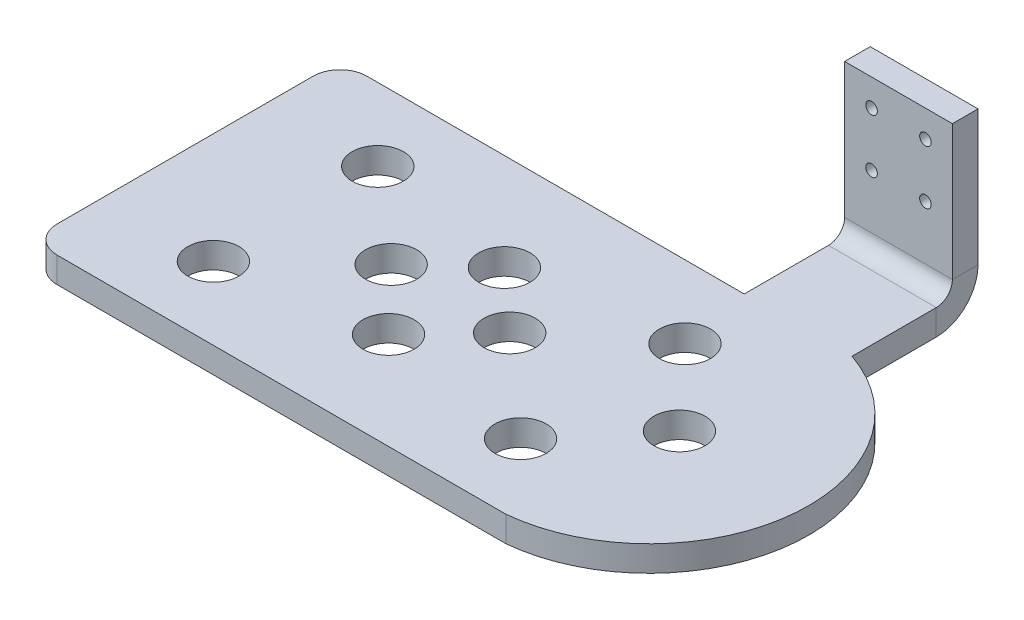
ISO-10303-21;
HEADER;
FILE_DESCRIPTION(('STEP AP214'),'2;1');
FILE_NAME('part.step','',(''),(''),'','','');
FILE_SCHEMA(('AUTOMOTIVE_DESIGN { 1 0 10303 214 1 1 1 1 }'));
ENDSEC;
DATA;
#1=APPLICATION_CONTEXT('core data for automotive mechanical design processes');
#2=APPLICATION_PROTOCOL_DEFINITION('international standard','automotive_design',2000,#1);
#3=PRODUCT_CONTEXT('',#1,'mechanical');
#4=PRODUCT('Part','Part','',(#3));
#5=PRODUCT_RELATED_PRODUCT_CATEGORY('part','',(#4));
#6=PRODUCT_DEFINITION_FORMATION('','',#4);
#7=PRODUCT_DEFINITION_CONTEXT('part definition',#1,'design');
#8=PRODUCT_DEFINITION('design','',#6,#7);
#9=PRODUCT_DEFINITION_SHAPE('','',#8);
#10=(LENGTH_UNIT() NAMED_UNIT(*) SI_UNIT(.MILLI.,.METRE.));
#11=(NAMED_UNIT(*) PLANE_ANGLE_UNIT() SI_UNIT($,.RADIAN.));
#12=(NAMED_UNIT(*) SI_UNIT($,.STERADIAN.) SOLID_ANGLE_UNIT());
#13=UNCERTAINTY_MEASURE_WITH_UNIT(LENGTH_MEASURE(1.E-05),#10,'distance_accuracy_value','');
#14=(GEOMETRIC_REPRESENTATION_CONTEXT(3) GLOBAL_UNCERTAINTY_ASSIGNED_CONTEXT((#13)) GLOBAL_UNIT_ASSIGNED_CONTEXT((#10,
#11,#12)) REPRESENTATION_CONTEXT('',''));
#15=CARTESIAN_POINT('',(0.,0.,0.));
#16=DIRECTION('',(0.,0.,1.));
#17=DIRECTION('',(1.,0.,0.));
#18=AXIS2_PLACEMENT_3D('',#15,#16,#17);
#19=CARTESIAN_POINT('',(170.75,-88.6717634175328,-37.2500000000004));
#20=DIRECTION('',(0.,0.,-1.));
#21=DIRECTION('',(0.,1.,0.));
#22=AXIS2_PLACEMENT_3D('',#19,#20,#21);
#23=PLANE('',#22);
#24=CARTESIAN_POINT('',(160.,35.6139394869549,-37.2499999999999));
#25=DIRECTION('',(0.,0.,1.));
#26=DIRECTION('',(0.,-1.,0.));
#27=AXIS2_PLACEMENT_3D('',#24,#25,#26);
#28=CIRCLE('',#27,2.15000000000001);
#29=CARTESIAN_POINT('',(160.,33.4639394869548,-37.2499999999999));
#30=VERTEX_POINT('',#29);
#31=EDGE_CURVE('E131',#30,#30,#28,.T.);
#32=ORIENTED_EDGE('',*,*,#31,.F.);
#33=EDGE_LOOP('',(#32));
#34=FACE_BOUND('',#33,.T.);
#35=CARTESIAN_POINT('',(180.,35.6139394869549,-37.2499999999999));
#36=DIRECTION('',(0.,0.,1.));
#37=DIRECTION('',(0.,-1.,0.));
#38=AXIS2_PLACEMENT_3D('',#35,#36,#37);
#39=CIRCLE('',#38,2.15000000000001);
#40=CARTESIAN_POINT('',(180.,33.4639394869549,-37.2499999999999));
#41=VERTEX_POINT('',#40);
#42=EDGE_CURVE('E125',#41,#41,#39,.T.);
#43=ORIENTED_EDGE('',*,*,#42,.F.);
#44=EDGE_LOOP('',(#43));
#45=FACE_BOUND('',#44,.T.);
#46=CARTESIAN_POINT('',(180.,55.6139394869549,-37.2499999999999));
#47=DIRECTION('',(0.,0.,1.));
#48=DIRECTION('',(0.,-1.,0.));
#49=AXIS2_PLACEMENT_3D('',#46,#47,#48);
#50=CIRCLE('',#49,2.15000000000001);
#51=CARTESIAN_POINT('',(180.,53.4639394869549,-37.2499999999999));
#52=VERTEX_POINT('',#51);
#53=EDGE_CURVE('E119',#52,#52,#50,.T.);
#54=ORIENTED_EDGE('',*,*,#53,.F.);
#55=EDGE_LOOP('',(#54));
#56=FACE_BOUND('',#55,.T.);
#57=CARTESIAN_POINT('',(160.,55.6139394869549,-37.2499999999999));
#58=DIRECTION('',(0.,0.,1.));
#59=DIRECTION('',(0.,-1.,0.));
#60=AXIS2_PLACEMENT_3D('',#57,#58,#59);
#61=CIRCLE('',#60,2.15000000000001);
#62=CARTESIAN_POINT('',(160.,53.4639394869548,-37.2499999999999));
#63=VERTEX_POINT('',#62);
#64=EDGE_CURVE('E106',#63,#63,#61,.T.);
#65=ORIENTED_EDGE('',*,*,#64,.F.);
#66=EDGE_LOOP('',(#65));
#67=FACE_BOUND('',#66,.T.);
#68=DIRECTION('',(0.,-1.,0.));
#69=VECTOR('',#68,1.);
#70=CARTESIAN_POINT('',(150.,-32.6360605130452,-37.2500000000002));
#71=LINE('',#70,#69);
#72=CARTESIAN_POINT('',(150.,65.6139394869548,-37.2499999999998));
#73=VERTEX_POINT('',#72);
#74=CARTESIAN_POINT('',(150.,15.5,-37.25));
#75=VERTEX_POINT('',#74);
#76=EDGE_CURVE('E45',#73,#75,#71,.T.);
#77=ORIENTED_EDGE('',*,*,#76,.T.);
#78=DIRECTION('',(1.,0.,0.));
#79=VECTOR('',#78,1.);
#80=CARTESIAN_POINT('',(170.75,15.5,-37.25));
#81=LINE('',#80,#79);
#82=CARTESIAN_POINT('',(190.,15.5,-37.25));
#83=VERTEX_POINT('',#82);
#84=EDGE_CURVE('E111',#75,#83,#81,.T.);
#85=ORIENTED_EDGE('',*,*,#84,.T.);
#86=DIRECTION('',(0.,1.,0.));
#87=VECTOR('',#86,1.);
#88=CARTESIAN_POINT('',(190.,-32.6360605130452,-37.2500000000002));
#89=LINE('',#88,#87);
#90=CARTESIAN_POINT('',(190.,65.6139394869548,-37.2499999999998));
#91=VERTEX_POINT('',#90);
#92=EDGE_CURVE('E103',#83,#91,#89,.T.);
#93=ORIENTED_EDGE('',*,*,#92,.T.);
#94=DIRECTION('',(-1.,0.,0.));
#95=VECTOR('',#94,1.);
#96=CARTESIAN_POINT('',(150.,65.6139394869548,-37.2499999999998));
#97=LINE('',#96,#95);
#98=EDGE_CURVE('E67',#91,#73,#97,.T.);
#99=ORIENTED_EDGE('',*,*,#98,.T.);
#100=EDGE_LOOP('',(#77,#85,#93,#99));
#101=FACE_BOUND('',#100,.T.);
#102=ADVANCED_FACE('F41',(#34,#45,#56,#67,#101),#23,.F.);
#103=CARTESIAN_POINT('',(190.,-32.6360605130452,-37.2500000000002));
#104=DIRECTION('',(-1.,0.,0.));
#105=DIRECTION('',(0.,-1.,0.));
#106=AXIS2_PLACEMENT_3D('',#103,#104,#105);
#107=PLANE('',#106);
#108=ORIENTED_EDGE('',*,*,#92,.F.);
#109=DIRECTION('',(0.,0.,-1.));
#110=VECTOR('',#109,1.);
#111=CARTESIAN_POINT('',(190.,15.5,-37.25));
#112=LINE('',#111,#110);
#113=CARTESIAN_POINT('',(190.,15.5000000000001,-46.75));
#114=VERTEX_POINT('',#113);
#115=EDGE_CURVE('E12',#83,#114,#112,.T.);
#116=ORIENTED_EDGE('',*,*,#115,.T.);
#117=DIRECTION('',(0.,1.,0.));
#118=VECTOR('',#117,1.);
#119=CARTESIAN_POINT('',(190.,-32.6360605130451,-46.7500000000002));
#120=LINE('',#119,#118);
#121=CARTESIAN_POINT('',(190.,65.6139394869549,-46.7499999999998));
#122=VERTEX_POINT('',#121);
#123=EDGE_CURVE('E91',#114,#122,#120,.T.);
#124=ORIENTED_EDGE('',*,*,#123,.T.);
#125=DIRECTION('',(0.,0.,-1.));
#126=VECTOR('',#125,1.);
#127=CARTESIAN_POINT('',(190.,65.6139394869548,-37.2499999999998));
#128=LINE('',#127,#126);
#129=EDGE_CURVE('E86',#91,#122,#128,.T.);
#130=ORIENTED_EDGE('',*,*,#129,.F.);
#131=EDGE_LOOP('',(#108,#116,#124,#130));
#132=FACE_BOUND('',#131,.T.);
#133=ADVANCED_FACE('F43',(#132),#107,.F.);
#134=CARTESIAN_POINT('',(150.,-32.6360605130452,-37.2500000000002));
#135=DIRECTION('',(1.,0.,0.));
#136=DIRECTION('',(0.,1.,0.));
#137=AXIS2_PLACEMENT_3D('',#134,#135,#136);
#138=PLANE('',#137);
#139=DIRECTION('',(0.,-1.,0.));
#140=VECTOR('',#139,1.);
#141=CARTESIAN_POINT('',(150.,-32.6360605130451,-46.7500000000002));
#142=LINE('',#141,#140);
#143=CARTESIAN_POINT('',(150.,65.6139394869549,-46.7499999999998));
#144=VERTEX_POINT('',#143);
#145=CARTESIAN_POINT('',(150.,15.5000000000001,-46.75));
#146=VERTEX_POINT('',#145);
#147=EDGE_CURVE('E90',#144,#146,#142,.T.);
#148=ORIENTED_EDGE('',*,*,#147,.T.);
#149=DIRECTION('',(0.,0.,1.));
#150=VECTOR('',#149,1.);
#151=CARTESIAN_POINT('',(150.,15.5,-37.25));
#152=LINE('',#151,#150);
#153=EDGE_CURVE('E109',#146,#75,#152,.T.);
#154=ORIENTED_EDGE('',*,*,#153,.T.);
#155=ORIENTED_EDGE('',*,*,#76,.F.);
#156=DIRECTION('',(0.,0.,-1.));
#157=VECTOR('',#156,1.);
#158=CARTESIAN_POINT('',(150.,65.6139394869548,-37.2499999999998));
#159=LINE('',#158,#157);
#160=EDGE_CURVE('E83',#73,#144,#159,.T.);
#161=ORIENTED_EDGE('',*,*,#160,.T.);
#162=EDGE_LOOP('',(#148,#154,#155,#161));
#163=FACE_BOUND('',#162,.T.);
#164=ADVANCED_FACE('F95',(#163),#138,.F.);
#165=CARTESIAN_POINT('',(170.75,-88.6717634175327,-46.7500000000004));
#166=DIRECTION('',(0.,0.,-1.));
#167=DIRECTION('',(0.,1.,0.));
#168=AXIS2_PLACEMENT_3D('',#165,#166,#167);
#169=PLANE('',#168);
#170=DIRECTION('',(1.,0.,0.));
#171=VECTOR('',#170,1.);
#172=CARTESIAN_POINT('',(170.75,15.5000000000001,-46.75));
#173=LINE('',#172,#171);
#174=EDGE_CURVE('E50',#146,#114,#173,.T.);
#175=ORIENTED_EDGE('',*,*,#174,.F.);
#176=ORIENTED_EDGE('',*,*,#147,.F.);
#177=DIRECTION('',(-1.,0.,0.));
#178=VECTOR('',#177,1.);
#179=CARTESIAN_POINT('',(150.,65.6139394869549,-46.7499999999998));
#180=LINE('',#179,#178);
#181=EDGE_CURVE('E80',#122,#144,#180,.T.);
#182=ORIENTED_EDGE('',*,*,#181,.F.);
#183=ORIENTED_EDGE('',*,*,#123,.F.);
#184=EDGE_LOOP('',(#175,#176,#182,#183));
#185=FACE_BOUND('',#184,.T.);
#186=CARTESIAN_POINT('',(160.,35.6139394869549,-46.7499999999999));
#187=DIRECTION('',(0.,0.,1.));
#188=DIRECTION('',(0.,-1.,0.));
#189=AXIS2_PLACEMENT_3D('',#186,#187,#188);
#190=CIRCLE('',#189,2.15000000000001);
#191=CARTESIAN_POINT('',(160.,33.4639394869549,-46.7499999999999));
#192=VERTEX_POINT('',#191);
#193=EDGE_CURVE('E134',#192,#192,#190,.T.);
#194=ORIENTED_EDGE('',*,*,#193,.T.);
#195=EDGE_LOOP('',(#194));
#196=FACE_BOUND('',#195,.T.);
#197=CARTESIAN_POINT('',(180.,55.6139394869549,-46.7499999999999));
#198=DIRECTION('',(0.,0.,1.));
#199=DIRECTION('',(0.,-1.,0.));
#200=AXIS2_PLACEMENT_3D('',#197,#198,#199);
#201=CIRCLE('',#200,2.15000000000001);
#202=CARTESIAN_POINT('',(180.,53.4639394869549,-46.7499999999999));
#203=VERTEX_POINT('',#202);
#204=EDGE_CURVE('E122',#203,#203,#201,.T.);
#205=ORIENTED_EDGE('',*,*,#204,.T.);
#206=EDGE_LOOP('',(#205));
#207=FACE_BOUND('',#206,.T.);
#208=CARTESIAN_POINT('',(160.,55.6139394869549,-46.7499999999999));
#209=DIRECTION('',(0.,0.,1.));
#210=DIRECTION('',(0.,-1.,0.));
#211=AXIS2_PLACEMENT_3D('',#208,#209,#210);
#212=CIRCLE('',#211,2.15000000000001);
#213=CARTESIAN_POINT('',(160.,53.4639394869549,-46.7499999999999));
#214=VERTEX_POINT('',#213);
#215=EDGE_CURVE('E116',#214,#214,#212,.T.);
#216=ORIENTED_EDGE('',*,*,#215,.T.);
#217=EDGE_LOOP('',(#216));
#218=FACE_BOUND('',#217,.T.);
#219=CARTESIAN_POINT('',(180.,35.6139394869549,-46.7499999999999));
#220=DIRECTION('',(0.,0.,1.));
#221=DIRECTION('',(0.,-1.,0.));
#222=AXIS2_PLACEMENT_3D('',#219,#220,#221);
#223=CIRCLE('',#222,2.15000000000001);
#224=CARTESIAN_POINT('',(180.,33.4639394869549,-46.7499999999999));
#225=VERTEX_POINT('',#224);
#226=EDGE_CURVE('E128',#225,#225,#223,.T.);
#227=ORIENTED_EDGE('',*,*,#226,.T.);
#228=EDGE_LOOP('',(#227));
#229=FACE_BOUND('',#228,.T.);
#230=ADVANCED_FACE('F100',(#185,#196,#207,#218,#229),#169,.T.);
#231=CARTESIAN_POINT('',(150.,65.6139394869548,-37.2499999999998));
#232=DIRECTION('',(0.,-1.,0.));
#233=DIRECTION('',(1.,0.,0.));
#234=AXIS2_PLACEMENT_3D('',#231,#232,#233);
#235=PLANE('',#234);
#236=ORIENTED_EDGE('',*,*,#181,.T.);
#237=ORIENTED_EDGE('',*,*,#160,.F.);
#238=ORIENTED_EDGE('',*,*,#98,.F.);
#239=ORIENTED_EDGE('',*,*,#129,.T.);
#240=EDGE_LOOP('',(#236,#237,#238,#239));
#241=FACE_BOUND('',#240,.T.);
#242=ADVANCED_FACE('F82',(#241),#235,.F.);
#243=CARTESIAN_POINT('',(160.,55.6139394869549,-37.2499999999999));
#244=DIRECTION('',(0.,0.,-1.));
#245=DIRECTION('',(0.,1.,0.));
#246=AXIS2_PLACEMENT_3D('',#243,#244,#245);
#247=CYLINDRICAL_SURFACE('',#246,2.15000000000001);
#248=ORIENTED_EDGE('',*,*,#64,.T.);
#249=EDGE_LOOP('',(#248));
#250=FACE_BOUND('',#249,.T.);
#251=ORIENTED_EDGE('',*,*,#215,.F.);
#252=EDGE_LOOP('',(#251));
#253=FACE_BOUND('',#252,.T.);
#254=ADVANCED_FACE('F409',(#250,#253),#247,.F.);
#255=CARTESIAN_POINT('',(180.,55.6139394869549,-37.2499999999999));
#256=DIRECTION('',(0.,0.,-1.));
#257=DIRECTION('',(0.,1.,0.));
#258=AXIS2_PLACEMENT_3D('',#255,#256,#257);
#259=CYLINDRICAL_SURFACE('',#258,2.15000000000001);
#260=ORIENTED_EDGE('',*,*,#53,.T.);
#261=EDGE_LOOP('',(#260));
#262=FACE_BOUND('',#261,.T.);
#263=ORIENTED_EDGE('',*,*,#204,.F.);
#264=EDGE_LOOP('',(#263));
#265=FACE_BOUND('',#264,.T.);
#266=ADVANCED_FACE('F413',(#262,#265),#259,.F.);
#267=CARTESIAN_POINT('',(180.,35.6139394869549,-37.2499999999999));
#268=DIRECTION('',(0.,0.,-1.));
#269=DIRECTION('',(0.,1.,0.));
#270=AXIS2_PLACEMENT_3D('',#267,#268,#269);
#271=CYLINDRICAL_SURFACE('',#270,2.15000000000001);
#272=ORIENTED_EDGE('',*,*,#42,.T.);
#273=EDGE_LOOP('',(#272));
#274=FACE_BOUND('',#273,.T.);
#275=ORIENTED_EDGE('',*,*,#226,.F.);
#276=EDGE_LOOP('',(#275));
#277=FACE_BOUND('',#276,.T.);
#278=ADVANCED_FACE('F418',(#274,#277),#271,.F.);
#279=CARTESIAN_POINT('',(160.,35.6139394869549,-37.2499999999999));
#280=DIRECTION('',(0.,0.,-1.));
#281=DIRECTION('',(0.,1.,0.));
#282=AXIS2_PLACEMENT_3D('',#279,#280,#281);
#283=CYLINDRICAL_SURFACE('',#282,2.15000000000001);
#284=ORIENTED_EDGE('',*,*,#31,.T.);
#285=EDGE_LOOP('',(#284));
#286=FACE_BOUND('',#285,.T.);
#287=ORIENTED_EDGE('',*,*,#193,.F.);
#288=EDGE_LOOP('',(#287));
#289=FACE_BOUND('',#288,.T.);
#290=ADVANCED_FACE('F425',(#286,#289),#283,.F.);
#291=CARTESIAN_POINT('',(155.,9.5,88.));
#292=DIRECTION('',(0.,-1.,0.));
#293=DIRECTION('',(0.,0.,-1.));
#294=AXIS2_PLACEMENT_3D('',#291,#292,#293);
#295=CYLINDRICAL_SURFACE('',#294,9.50000000000001);
#296=CARTESIAN_POINT('',(155.,9.5,88.));
#297=DIRECTION('',(0.,1.,0.));
#298=DIRECTION('',(0.,0.,1.));
#299=AXIS2_PLACEMENT_3D('',#296,#297,#298);
#300=CIRCLE('',#299,9.50000000000001);
#301=CARTESIAN_POINT('',(155.,9.5,97.5));
#302=VERTEX_POINT('',#301);
#303=EDGE_CURVE('E148',#302,#302,#300,.T.);
#304=ORIENTED_EDGE('',*,*,#303,.T.);
#305=EDGE_LOOP('',(#304));
#306=FACE_BOUND('',#305,.T.);
#307=CARTESIAN_POINT('',(155.,0.,88.));
#308=DIRECTION('',(0.,1.,0.));
#309=DIRECTION('',(0.,0.,1.));
#310=AXIS2_PLACEMENT_3D('',#307,#308,#309);
#311=CIRCLE('',#310,9.50000000000001);
#312=CARTESIAN_POINT('',(155.,0.,97.5));
#313=VERTEX_POINT('',#312);
#314=EDGE_CURVE('E238',#313,#313,#311,.T.);
#315=ORIENTED_EDGE('',*,*,#314,.F.);
#316=EDGE_LOOP('',(#315));
#317=FACE_BOUND('',#316,.T.);
#318=ADVANCED_FACE('F429',(#306,#317),#295,.F.);
#319=CARTESIAN_POINT('',(182.,9.5,56.0357029044876));
#320=DIRECTION('',(0.,-1.,0.));
#321=DIRECTION('',(0.,0.,-1.));
#322=AXIS2_PLACEMENT_3D('',#319,#320,#321);
#323=CYLINDRICAL_SURFACE('',#322,9.50000000000001);
#324=CARTESIAN_POINT('',(182.,9.5,56.0357029044876));
#325=DIRECTION('',(0.,1.,0.));
#326=DIRECTION('',(0.,0.,1.));
#327=AXIS2_PLACEMENT_3D('',#324,#325,#326);
#328=CIRCLE('',#327,9.50000000000001);
#329=CARTESIAN_POINT('',(182.,9.5,65.5357029044876));
#330=VERTEX_POINT('',#329);
#331=EDGE_CURVE('E151',#330,#330,#328,.T.);
#332=ORIENTED_EDGE('',*,*,#331,.T.);
#333=EDGE_LOOP('',(#332));
#334=FACE_BOUND('',#333,.T.);
#335=CARTESIAN_POINT('',(182.,0.,56.0357029044876));
#336=DIRECTION('',(0.,1.,0.));
#337=DIRECTION('',(0.,0.,1.));
#338=AXIS2_PLACEMENT_3D('',#335,#336,#337);
#339=CIRCLE('',#338,9.50000000000001);
#340=CARTESIAN_POINT('',(182.,0.,65.5357029044876));
#341=VERTEX_POINT('',#340);
#342=EDGE_CURVE('E262',#341,#341,#339,.T.);
#343=ORIENTED_EDGE('',*,*,#342,.F.);
#344=EDGE_LOOP('',(#343));
#345=FACE_BOUND('',#344,.T.);
#346=ADVANCED_FACE('F634',(#334,#345),#323,.F.);
#347=CARTESIAN_POINT('',(155.,9.5,27.));
#348=DIRECTION('',(0.,-1.,0.));
#349=DIRECTION('',(0.,0.,-1.));
#350=AXIS2_PLACEMENT_3D('',#347,#348,#349);
#351=CYLINDRICAL_SURFACE('',#350,9.50000000000001);
#352=CARTESIAN_POINT('',(155.,9.5,27.));
#353=DIRECTION('',(0.,1.,0.));
#354=DIRECTION('',(0.,0.,1.));
#355=AXIS2_PLACEMENT_3D('',#352,#353,#354);
#356=CIRCLE('',#355,9.50000000000001);
#357=CARTESIAN_POINT('',(155.,9.5,36.5));
#358=VERTEX_POINT('',#357);
#359=EDGE_CURVE('E154',#358,#358,#356,.T.);
#360=ORIENTED_EDGE('',*,*,#359,.T.);
#361=EDGE_LOOP('',(#360));
#362=FACE_BOUND('',#361,.T.);
#363=CARTESIAN_POINT('',(155.,0.,27.));
#364=DIRECTION('',(0.,1.,0.));
#365=DIRECTION('',(0.,0.,1.));
#366=AXIS2_PLACEMENT_3D('',#363,#364,#365);
#367=CIRCLE('',#366,9.50000000000001);
#368=CARTESIAN_POINT('',(155.,0.,36.5));
#369=VERTEX_POINT('',#368);
#370=EDGE_CURVE('E241',#369,#369,#367,.T.);
#371=ORIENTED_EDGE('',*,*,#370,.F.);
#372=EDGE_LOOP('',(#371));
#373=FACE_BOUND('',#372,.T.);
#374=ADVANCED_FACE('F623',(#362,#373),#351,.F.);
#375=CARTESIAN_POINT('',(97.,9.5,79.));
#376=DIRECTION('',(0.,-1.,0.));
#377=DIRECTION('',(0.,0.,-1.));
#378=AXIS2_PLACEMENT_3D('',#375,#376,#377);
#379=CYLINDRICAL_SURFACE('',#378,9.49999999999999);
#380=CARTESIAN_POINT('',(97.,9.5,79.));
#381=DIRECTION('',(0.,1.,0.));
#382=DIRECTION('',(0.,0.,1.));
#383=AXIS2_PLACEMENT_3D('',#380,#381,#382);
#384=CIRCLE('',#383,9.49999999999999);
#385=CARTESIAN_POINT('',(97.,9.5,88.5));
#386=VERTEX_POINT('',#385);
#387=EDGE_CURVE('E157',#386,#386,#384,.T.);
#388=ORIENTED_EDGE('',*,*,#387,.T.);
#389=EDGE_LOOP('',(#388));
#390=FACE_BOUND('',#389,.T.);
#391=CARTESIAN_POINT('',(97.,0.,79.));
#392=DIRECTION('',(0.,1.,0.));
#393=DIRECTION('',(0.,0.,1.));
#394=AXIS2_PLACEMENT_3D('',#391,#392,#393);
#395=CIRCLE('',#394,9.49999999999999);
#396=CARTESIAN_POINT('',(97.,0.,88.5));
#397=VERTEX_POINT('',#396);
#398=EDGE_CURVE('E259',#397,#397,#395,.T.);
#399=ORIENTED_EDGE('',*,*,#398,.F.);
#400=EDGE_LOOP('',(#399));
#401=FACE_BOUND('',#400,.T.);
#402=ADVANCED_FACE('F612',(#390,#401),#379,.F.);
#403=CARTESIAN_POINT('',(97.,9.5,36.));
#404=DIRECTION('',(0.,-1.,0.));
#405=DIRECTION('',(0.,0.,-1.));
#406=AXIS2_PLACEMENT_3D('',#403,#404,#405);
#407=CYLINDRICAL_SURFACE('',#406,9.5);
#408=CARTESIAN_POINT('',(97.,9.5,36.));
#409=DIRECTION('',(0.,1.,0.));
#410=DIRECTION('',(0.,0.,1.));
#411=AXIS2_PLACEMENT_3D('',#408,#409,#410);
#412=CIRCLE('',#411,9.5);
#413=CARTESIAN_POINT('',(97.,9.5,45.5));
#414=VERTEX_POINT('',#413);
#415=EDGE_CURVE('E160',#414,#414,#412,.T.);
#416=ORIENTED_EDGE('',*,*,#415,.T.);
#417=EDGE_LOOP('',(#416));
#418=FACE_BOUND('',#417,.T.);
#419=CARTESIAN_POINT('',(97.,0.,36.));
#420=DIRECTION('',(0.,1.,0.));
#421=DIRECTION('',(0.,0.,1.));
#422=AXIS2_PLACEMENT_3D('',#419,#420,#421);
#423=CIRCLE('',#422,9.5);
#424=CARTESIAN_POINT('',(97.,0.,45.5));
#425=VERTEX_POINT('',#424);
#426=EDGE_CURVE('E244',#425,#425,#423,.T.);
#427=ORIENTED_EDGE('',*,*,#426,.F.);
#428=EDGE_LOOP('',(#427));
#429=FACE_BOUND('',#428,.T.);
#430=ADVANCED_FACE('F601',(#418,#429),#407,.F.);
#431=CARTESIAN_POINT('',(119.,9.5,56.0357029044876));
#432=DIRECTION('',(0.,-1.,0.));
#433=DIRECTION('',(0.,0.,-1.));
#434=AXIS2_PLACEMENT_3D('',#431,#432,#433);
#435=CYLINDRICAL_SURFACE('',#434,9.50000000000001);
#436=CARTESIAN_POINT('',(119.,9.5,56.0357029044876));
#437=DIRECTION('',(0.,1.,0.));
#438=DIRECTION('',(0.,0.,1.));
#439=AXIS2_PLACEMENT_3D('',#436,#437,#438);
#440=CIRCLE('',#439,9.50000000000001);
#441=CARTESIAN_POINT('',(119.,9.5,65.5357029044876));
#442=VERTEX_POINT('',#441);
#443=EDGE_CURVE('E163',#442,#442,#440,.T.);
#444=ORIENTED_EDGE('',*,*,#443,.T.);
#445=EDGE_LOOP('',(#444));
#446=FACE_BOUND('',#445,.T.);
#447=CARTESIAN_POINT('',(119.,0.,56.0357029044876));
#448=DIRECTION('',(0.,1.,0.));
#449=DIRECTION('',(0.,0.,1.));
#450=AXIS2_PLACEMENT_3D('',#447,#448,#449);
#451=CIRCLE('',#450,9.50000000000001);
#452=CARTESIAN_POINT('',(119.,0.,65.5357029044876));
#453=VERTEX_POINT('',#452);
#454=EDGE_CURVE('E256',#453,#453,#451,.T.);
#455=ORIENTED_EDGE('',*,*,#454,.F.);
#456=EDGE_LOOP('',(#455));
#457=FACE_BOUND('',#456,.T.);
#458=ADVANCED_FACE('F590',(#446,#457),#435,.F.);
#459=CARTESIAN_POINT('',(75.,9.5,56.0357029044876));
#460=DIRECTION('',(0.,-1.,0.));
#461=DIRECTION('',(0.,0.,-1.));
#462=AXIS2_PLACEMENT_3D('',#459,#460,#461);
#463=CYLINDRICAL_SURFACE('',#462,9.5);
#464=CARTESIAN_POINT('',(75.,9.5,56.0357029044876));
#465=DIRECTION('',(0.,1.,0.));
#466=DIRECTION('',(0.,0.,1.));
#467=AXIS2_PLACEMENT_3D('',#464,#465,#466);
#468=CIRCLE('',#467,9.5);
#469=CARTESIAN_POINT('',(75.,9.5,65.5357029044876));
#470=VERTEX_POINT('',#469);
#471=EDGE_CURVE('E166',#470,#470,#468,.T.);
#472=ORIENTED_EDGE('',*,*,#471,.T.);
#473=EDGE_LOOP('',(#472));
#474=FACE_BOUND('',#473,.T.);
#475=CARTESIAN_POINT('',(75.,0.,56.0357029044876));
#476=DIRECTION('',(0.,1.,0.));
#477=DIRECTION('',(0.,0.,1.));
#478=AXIS2_PLACEMENT_3D('',#475,#476,#477);
#479=CIRCLE('',#478,9.5);
#480=CARTESIAN_POINT('',(75.,0.,65.5357029044876));
#481=VERTEX_POINT('',#480);
#482=EDGE_CURVE('E247',#481,#481,#479,.T.);
#483=ORIENTED_EDGE('',*,*,#482,.F.);
#484=EDGE_LOOP('',(#483));
#485=FACE_BOUND('',#484,.T.);
#486=ADVANCED_FACE('F579',(#474,#485),#463,.F.);
#487=CARTESIAN_POINT('',(41.,9.5,88.));
#488=DIRECTION('',(0.,-1.,0.));
#489=DIRECTION('',(0.,0.,-1.));
#490=AXIS2_PLACEMENT_3D('',#487,#488,#489);
#491=CYLINDRICAL_SURFACE('',#490,9.50000000000001);
#492=CARTESIAN_POINT('',(41.,9.5,88.));
#493=DIRECTION('',(0.,1.,0.));
#494=DIRECTION('',(0.,0.,1.));
#495=AXIS2_PLACEMENT_3D('',#492,#493,#494);
#496=CIRCLE('',#495,9.50000000000001);
#497=CARTESIAN_POINT('',(41.,9.5,97.5));
#498=VERTEX_POINT('',#497);
#499=EDGE_CURVE('E169',#498,#498,#496,.T.);
#500=ORIENTED_EDGE('',*,*,#499,.T.);
#501=EDGE_LOOP('',(#500));
#502=FACE_BOUND('',#501,.T.);
#503=CARTESIAN_POINT('',(41.,0.,88.));
#504=DIRECTION('',(0.,1.,0.));
#505=DIRECTION('',(0.,0.,1.));
#506=AXIS2_PLACEMENT_3D('',#503,#504,#505);
#507=CIRCLE('',#506,9.50000000000001);
#508=CARTESIAN_POINT('',(41.,0.,97.5));
#509=VERTEX_POINT('',#508);
#510=EDGE_CURVE('E253',#509,#509,#507,.T.);
#511=ORIENTED_EDGE('',*,*,#510,.F.);
#512=EDGE_LOOP('',(#511));
#513=FACE_BOUND('',#512,.T.);
#514=ADVANCED_FACE('F390',(#502,#513),#491,.F.);
#515=CARTESIAN_POINT('',(41.,9.5,27.));
#516=DIRECTION('',(0.,-1.,0.));
#517=DIRECTION('',(0.,0.,-1.));
#518=AXIS2_PLACEMENT_3D('',#515,#516,#517);
#519=CYLINDRICAL_SURFACE('',#518,9.49999999999999);
#520=CARTESIAN_POINT('',(41.,9.5,27.));
#521=DIRECTION('',(0.,1.,0.));
#522=DIRECTION('',(0.,0.,1.));
#523=AXIS2_PLACEMENT_3D('',#520,#521,#522);
#524=CIRCLE('',#523,9.49999999999999);
#525=CARTESIAN_POINT('',(41.,9.5,36.5));
#526=VERTEX_POINT('',#525);
#527=EDGE_CURVE('E172',#526,#526,#524,.T.);
#528=ORIENTED_EDGE('',*,*,#527,.T.);
#529=EDGE_LOOP('',(#528));
#530=FACE_BOUND('',#529,.T.);
#531=CARTESIAN_POINT('',(41.,0.,27.));
#532=DIRECTION('',(0.,1.,0.));
#533=DIRECTION('',(0.,0.,1.));
#534=AXIS2_PLACEMENT_3D('',#531,#532,#533);
#535=CIRCLE('',#534,9.49999999999999);
#536=CARTESIAN_POINT('',(41.,0.,36.5));
#537=VERTEX_POINT('',#536);
#538=EDGE_CURVE('E250',#537,#537,#535,.T.);
#539=ORIENTED_EDGE('',*,*,#538,.F.);
#540=EDGE_LOOP('',(#539));
#541=FACE_BOUND('',#540,.T.);
#542=ADVANCED_FACE('F383',(#530,#541),#519,.F.);
#543=CARTESIAN_POINT('',(170.75,9.5,56.0357029044876));
#544=DIRECTION('',(0.,-1.,0.));
#545=DIRECTION('',(0.,0.,-1.));
#546=AXIS2_PLACEMENT_3D('',#543,#544,#545);
#547=CYLINDRICAL_SURFACE('',#546,59.25);
#548=CARTESIAN_POINT('',(170.75,0.,56.0357029044876));
#549=DIRECTION('',(0.,1.,0.));
#550=DIRECTION('',(0.,0.,-1.));
#551=AXIS2_PLACEMENT_3D('',#548,#549,#550);
#552=CIRCLE('',#551,59.25);
#553=CARTESIAN_POINT('',(176.561554700091,0.,115.));
#554=VERTEX_POINT('',#553);
#555=CARTESIAN_POINT('',(190.,0.,0.));
#556=VERTEX_POINT('',#555);
#557=EDGE_CURVE('E175',#554,#556,#552,.T.);
#558=ORIENTED_EDGE('',*,*,#557,.T.);
#559=DIRECTION('',(0.,-1.,0.));
#560=VECTOR('',#559,1.);
#561=CARTESIAN_POINT('',(190.,9.5,0.));
#562=LINE('',#561,#560);
#563=CARTESIAN_POINT('',(190.,9.5,0.));
#564=VERTEX_POINT('',#563);
#565=EDGE_CURVE('E268',#564,#556,#562,.T.);
#566=ORIENTED_EDGE('',*,*,#565,.F.);
#567=CARTESIAN_POINT('',(170.75,9.5,56.0357029044876));
#568=DIRECTION('',(0.,1.,0.));
#569=DIRECTION('',(0.,0.,-1.));
#570=AXIS2_PLACEMENT_3D('',#567,#568,#569);
#571=CIRCLE('',#570,59.25);
#572=CARTESIAN_POINT('',(176.561554700091,9.5,115.));
#573=VERTEX_POINT('',#572);
#574=EDGE_CURVE('E229',#573,#564,#571,.T.);
#575=ORIENTED_EDGE('',*,*,#574,.F.);
#576=DIRECTION('',(0.,-1.,0.));
#577=VECTOR('',#576,1.);
#578=CARTESIAN_POINT('',(176.561554700091,9.5,115.));
#579=LINE('',#578,#577);
#580=EDGE_CURVE('E178',#573,#554,#579,.T.);
#581=ORIENTED_EDGE('',*,*,#580,.T.);
#582=EDGE_LOOP('',(#558,#566,#575,#581));
#583=FACE_BOUND('',#582,.T.);
#584=ADVANCED_FACE('F381',(#583),#547,.T.);
#585=CARTESIAN_POINT('',(176.561554700091,9.5,115.));
#586=DIRECTION('',(0.,0.,-1.));
#587=DIRECTION('',(-1.,0.,0.));
#588=AXIS2_PLACEMENT_3D('',#585,#586,#587);
#589=PLANE('',#588);
#590=DIRECTION('',(1.,0.,0.));
#591=VECTOR('',#590,1.);
#592=CARTESIAN_POINT('',(176.561554700091,0.,115.));
#593=LINE('',#592,#591);
#594=CARTESIAN_POINT('',(9.99999999999998,0.,115.));
#595=VERTEX_POINT('',#594);
#596=EDGE_CURVE('E181',#595,#554,#593,.T.);
#597=ORIENTED_EDGE('',*,*,#596,.T.);
#598=ORIENTED_EDGE('',*,*,#580,.F.);
#599=DIRECTION('',(1.,0.,0.));
#600=VECTOR('',#599,1.);
#601=CARTESIAN_POINT('',(176.561554700091,9.5,115.));
#602=LINE('',#601,#600);
#603=CARTESIAN_POINT('',(9.99999999999998,9.5,115.));
#604=VERTEX_POINT('',#603);
#605=EDGE_CURVE('E226',#604,#573,#602,.T.);
#606=ORIENTED_EDGE('',*,*,#605,.F.);
#607=DIRECTION('',(0.,-1.,0.));
#608=VECTOR('',#607,1.);
#609=CARTESIAN_POINT('',(9.99999999999998,9.5,115.));
#610=LINE('',#609,#608);
#611=EDGE_CURVE('E184',#604,#595,#610,.T.);
#612=ORIENTED_EDGE('',*,*,#611,.T.);
#613=EDGE_LOOP('',(#597,#598,#606,#612));
#614=FACE_BOUND('',#613,.T.);
#615=ADVANCED_FACE('F379',(#614),#589,.F.);
#616=CARTESIAN_POINT('',(9.99999999999998,9.5,105.));
#617=DIRECTION('',(0.,-1.,0.));
#618=DIRECTION('',(0.,0.,-1.));
#619=AXIS2_PLACEMENT_3D('',#616,#617,#618);
#620=CYLINDRICAL_SURFACE('',#619,10.);
#621=CARTESIAN_POINT('',(9.99999999999998,0.,105.));
#622=DIRECTION('',(0.,1.,0.));
#623=DIRECTION('',(0.,0.,-1.));
#624=AXIS2_PLACEMENT_3D('',#621,#622,#623);
#625=CIRCLE('',#624,10.);
#626=CARTESIAN_POINT('',(0.,0.,105.));
#627=VERTEX_POINT('',#626);
#628=EDGE_CURVE('E187',#627,#595,#625,.T.);
#629=ORIENTED_EDGE('',*,*,#628,.T.);
#630=ORIENTED_EDGE('',*,*,#611,.F.);
#631=CARTESIAN_POINT('',(9.99999999999998,9.5,105.));
#632=DIRECTION('',(0.,1.,0.));
#633=DIRECTION('',(0.,0.,-1.));
#634=AXIS2_PLACEMENT_3D('',#631,#632,#633);
#635=CIRCLE('',#634,10.);
#636=CARTESIAN_POINT('',(0.,9.5,105.));
#637=VERTEX_POINT('',#636);
#638=EDGE_CURVE('E223',#637,#604,#635,.T.);
#639=ORIENTED_EDGE('',*,*,#638,.F.);
#640=DIRECTION('',(0.,-1.,0.));
#641=VECTOR('',#640,1.);
#642=CARTESIAN_POINT('',(0.,9.5,105.));
#643=LINE('',#642,#641);
#644=EDGE_CURVE('E190',#637,#627,#643,.T.);
#645=ORIENTED_EDGE('',*,*,#644,.T.);
#646=EDGE_LOOP('',(#629,#630,#639,#645));
#647=FACE_BOUND('',#646,.T.);
#648=ADVANCED_FACE('F375',(#647),#620,.T.);
#649=CARTESIAN_POINT('',(0.,9.5,105.));
#650=DIRECTION('',(1.,0.,0.));
#651=DIRECTION('',(0.,0.,-1.));
#652=AXIS2_PLACEMENT_3D('',#649,#650,#651);
#653=PLANE('',#652);
#654=DIRECTION('',(0.,0.,1.));
#655=VECTOR('',#654,1.);
#656=CARTESIAN_POINT('',(0.,0.,105.));
#657=LINE('',#656,#655);
#658=CARTESIAN_POINT('',(0.,0.,10.));
#659=VERTEX_POINT('',#658);
#660=EDGE_CURVE('E193',#659,#627,#657,.T.);
#661=ORIENTED_EDGE('',*,*,#660,.T.);
#662=ORIENTED_EDGE('',*,*,#644,.F.);
#663=DIRECTION('',(0.,0.,1.));
#664=VECTOR('',#663,1.);
#665=CARTESIAN_POINT('',(0.,9.5,105.));
#666=LINE('',#665,#664);
#667=CARTESIAN_POINT('',(0.,9.5,10.));
#668=VERTEX_POINT('',#667);
#669=EDGE_CURVE('E220',#668,#637,#666,.T.);
#670=ORIENTED_EDGE('',*,*,#669,.F.);
#671=DIRECTION('',(0.,-1.,0.));
#672=VECTOR('',#671,1.);
#673=CARTESIAN_POINT('',(0.,9.5,10.));
#674=LINE('',#673,#672);
#675=EDGE_CURVE('E196',#668,#659,#674,.T.);
#676=ORIENTED_EDGE('',*,*,#675,.T.);
#677=EDGE_LOOP('',(#661,#662,#670,#676));
#678=FACE_BOUND('',#677,.T.);
#679=ADVANCED_FACE('F369',(#678),#653,.F.);
#680=CARTESIAN_POINT('',(9.99999999999997,9.5,10.));
#681=DIRECTION('',(0.,-1.,0.));
#682=DIRECTION('',(0.,0.,-1.));
#683=AXIS2_PLACEMENT_3D('',#680,#681,#682);
#684=CYLINDRICAL_SURFACE('',#683,10.);
#685=CARTESIAN_POINT('',(9.99999999999997,0.,10.));
#686=DIRECTION('',(0.,1.,0.));
#687=DIRECTION('',(0.,0.,-1.));
#688=AXIS2_PLACEMENT_3D('',#685,#686,#687);
#689=CIRCLE('',#688,10.);
#690=CARTESIAN_POINT('',(9.99999999999997,0.,0.));
#691=VERTEX_POINT('',#690);
#692=EDGE_CURVE('E199',#691,#659,#689,.T.);
#693=ORIENTED_EDGE('',*,*,#692,.T.);
#694=ORIENTED_EDGE('',*,*,#675,.F.);
#695=CARTESIAN_POINT('',(9.99999999999997,9.5,10.));
#696=DIRECTION('',(0.,1.,0.));
#697=DIRECTION('',(0.,0.,-1.));
#698=AXIS2_PLACEMENT_3D('',#695,#696,#697);
#699=CIRCLE('',#698,10.);
#700=CARTESIAN_POINT('',(9.99999999999997,9.5,0.));
#701=VERTEX_POINT('',#700);
#702=EDGE_CURVE('E217',#701,#668,#699,.T.);
#703=ORIENTED_EDGE('',*,*,#702,.F.);
#704=DIRECTION('',(0.,-1.,0.));
#705=VECTOR('',#704,1.);
#706=CARTESIAN_POINT('',(9.99999999999997,9.5,0.));
#707=LINE('',#706,#705);
#708=EDGE_CURVE('E202',#701,#691,#707,.T.);
#709=ORIENTED_EDGE('',*,*,#708,.T.);
#710=EDGE_LOOP('',(#693,#694,#703,#709));
#711=FACE_BOUND('',#710,.T.);
#712=ADVANCED_FACE('F364',(#711),#684,.T.);
#713=CARTESIAN_POINT('',(9.99999999999997,9.5,0.));
#714=DIRECTION('',(0.,0.,1.));
#715=DIRECTION('',(1.,0.,0.));
#716=AXIS2_PLACEMENT_3D('',#713,#714,#715);
#717=PLANE('',#716);
#718=DIRECTION('',(-1.,0.,0.));
#719=VECTOR('',#718,1.);
#720=CARTESIAN_POINT('',(9.99999999999997,0.,0.));
#721=LINE('',#720,#719);
#722=CARTESIAN_POINT('',(150.,0.,0.));
#723=VERTEX_POINT('',#722);
#724=EDGE_CURVE('E205',#723,#691,#721,.T.);
#725=ORIENTED_EDGE('',*,*,#724,.T.);
#726=ORIENTED_EDGE('',*,*,#708,.F.);
#727=DIRECTION('',(-1.,0.,0.));
#728=VECTOR('',#727,1.);
#729=CARTESIAN_POINT('',(9.99999999999997,9.5,0.));
#730=LINE('',#729,#728);
#731=CARTESIAN_POINT('',(150.,9.5,0.));
#732=VERTEX_POINT('',#731);
#733=EDGE_CURVE('E214',#732,#701,#730,.T.);
#734=ORIENTED_EDGE('',*,*,#733,.F.);
#735=DIRECTION('',(0.,-1.,0.));
#736=VECTOR('',#735,1.);
#737=CARTESIAN_POINT('',(150.,9.5,0.));
#738=LINE('',#737,#736);
#739=EDGE_CURVE('E208',#732,#723,#738,.T.);
#740=ORIENTED_EDGE('',*,*,#739,.T.);
#741=EDGE_LOOP('',(#725,#726,#734,#740));
#742=FACE_BOUND('',#741,.T.);
#743=ADVANCED_FACE('F362',(#742),#717,.F.);
#744=CARTESIAN_POINT('',(170.75,9.5,56.0357029044876));
#745=DIRECTION('',(0.,-1.,0.));
#746=DIRECTION('',(0.,0.,-1.));
#747=AXIS2_PLACEMENT_3D('',#744,#745,#746);
#748=PLANE('',#747);
#749=DIRECTION('',(1.,0.,0.));
#750=VECTOR('',#749,1.);
#751=CARTESIAN_POINT('',(170.75,9.5,-31.25));
#752=LINE('',#751,#750);
#753=CARTESIAN_POINT('',(150.,9.5,-31.25));
#754=VERTEX_POINT('',#753);
#755=CARTESIAN_POINT('',(190.,9.5,-31.25));
#756=VERTEX_POINT('',#755);
#757=EDGE_CURVE('E140',#754,#756,#752,.T.);
#758=ORIENTED_EDGE('',*,*,#757,.F.);
#759=DIRECTION('',(0.,0.,1.));
#760=VECTOR('',#759,1.);
#761=CARTESIAN_POINT('',(150.,9.5,0.));
#762=LINE('',#761,#760);
#763=EDGE_CURVE('E211',#754,#732,#762,.T.);
#764=ORIENTED_EDGE('',*,*,#763,.T.);
#765=ORIENTED_EDGE('',*,*,#733,.T.);
#766=ORIENTED_EDGE('',*,*,#702,.T.);
#767=ORIENTED_EDGE('',*,*,#669,.T.);
#768=ORIENTED_EDGE('',*,*,#638,.T.);
#769=ORIENTED_EDGE('',*,*,#605,.T.);
#770=ORIENTED_EDGE('',*,*,#574,.T.);
#771=DIRECTION('',(0.,0.,-1.));
#772=VECTOR('',#771,1.);
#773=CARTESIAN_POINT('',(190.,9.5,0.));
#774=LINE('',#773,#772);
#775=EDGE_CURVE('E232',#564,#756,#774,.T.);
#776=ORIENTED_EDGE('',*,*,#775,.T.);
#777=EDGE_LOOP('',(#758,#764,#765,#766,#767,#768,#769,#770,#776));
#778=FACE_BOUND('',#777,.T.);
#779=ORIENTED_EDGE('',*,*,#527,.F.);
#780=EDGE_LOOP('',(#779));
#781=FACE_BOUND('',#780,.T.);
#782=ORIENTED_EDGE('',*,*,#499,.F.);
#783=EDGE_LOOP('',(#782));
#784=FACE_BOUND('',#783,.T.);
#785=ORIENTED_EDGE('',*,*,#471,.F.);
#786=EDGE_LOOP('',(#785));
#787=FACE_BOUND('',#786,.T.);
#788=ORIENTED_EDGE('',*,*,#443,.F.);
#789=EDGE_LOOP('',(#788));
#790=FACE_BOUND('',#789,.T.);
#791=ORIENTED_EDGE('',*,*,#415,.F.);
#792=EDGE_LOOP('',(#791));
#793=FACE_BOUND('',#792,.T.);
#794=ORIENTED_EDGE('',*,*,#387,.F.);
#795=EDGE_LOOP('',(#794));
#796=FACE_BOUND('',#795,.T.);
#797=ORIENTED_EDGE('',*,*,#359,.F.);
#798=EDGE_LOOP('',(#797));
#799=FACE_BOUND('',#798,.T.);
#800=ORIENTED_EDGE('',*,*,#331,.F.);
#801=EDGE_LOOP('',(#800));
#802=FACE_BOUND('',#801,.T.);
#803=ORIENTED_EDGE('',*,*,#303,.F.);
#804=EDGE_LOOP('',(#803));
#805=FACE_BOUND('',#804,.T.);
#806=ADVANCED_FACE('F339',(#778,#781,#784,#787,#790,#793,#796,#799,#802,#805),#748,.F.);
#807=CARTESIAN_POINT('',(150.,9.5,0.));
#808=DIRECTION('',(1.,0.,0.));
#809=DIRECTION('',(0.,0.,-1.));
#810=AXIS2_PLACEMENT_3D('',#807,#808,#809);
#811=PLANE('',#810);
#812=DIRECTION('',(0.,1.,0.));
#813=VECTOR('',#812,1.);
#814=CARTESIAN_POINT('',(150.,9.5,-31.25));
#815=LINE('',#814,#813);
#816=CARTESIAN_POINT('',(150.,0.,-31.25));
#817=VERTEX_POINT('',#816);
#818=EDGE_CURVE('E145',#817,#754,#815,.T.);
#819=ORIENTED_EDGE('',*,*,#818,.F.);
#820=DIRECTION('',(0.,0.,1.));
#821=VECTOR('',#820,1.);
#822=CARTESIAN_POINT('',(150.,0.,0.));
#823=LINE('',#822,#821);
#824=EDGE_CURVE('E235',#817,#723,#823,.T.);
#825=ORIENTED_EDGE('',*,*,#824,.T.);
#826=ORIENTED_EDGE('',*,*,#739,.F.);
#827=ORIENTED_EDGE('',*,*,#763,.F.);
#828=EDGE_LOOP('',(#819,#825,#826,#827));
#829=FACE_BOUND('',#828,.T.);
#830=ADVANCED_FACE('F356',(#829),#811,.F.);
#831=CARTESIAN_POINT('',(170.75,0.,56.0357029044876));
#832=DIRECTION('',(0.,-1.,0.));
#833=DIRECTION('',(0.,0.,-1.));
#834=AXIS2_PLACEMENT_3D('',#831,#832,#833);
#835=PLANE('',#834);
#836=ORIENTED_EDGE('',*,*,#314,.T.);
#837=EDGE_LOOP('',(#836));
#838=FACE_BOUND('',#837,.T.);
#839=ORIENTED_EDGE('',*,*,#370,.T.);
#840=EDGE_LOOP('',(#839));
#841=FACE_BOUND('',#840,.T.);
#842=ORIENTED_EDGE('',*,*,#426,.T.);
#843=EDGE_LOOP('',(#842));
#844=FACE_BOUND('',#843,.T.);
#845=ORIENTED_EDGE('',*,*,#482,.T.);
#846=EDGE_LOOP('',(#845));
#847=FACE_BOUND('',#846,.T.);
#848=ORIENTED_EDGE('',*,*,#538,.T.);
#849=EDGE_LOOP('',(#848));
#850=FACE_BOUND('',#849,.T.);
#851=ORIENTED_EDGE('',*,*,#510,.T.);
#852=EDGE_LOOP('',(#851));
#853=FACE_BOUND('',#852,.T.);
#854=ORIENTED_EDGE('',*,*,#454,.T.);
#855=EDGE_LOOP('',(#854));
#856=FACE_BOUND('',#855,.T.);
#857=ORIENTED_EDGE('',*,*,#398,.T.);
#858=EDGE_LOOP('',(#857));
#859=FACE_BOUND('',#858,.T.);
#860=ORIENTED_EDGE('',*,*,#342,.T.);
#861=EDGE_LOOP('',(#860));
#862=FACE_BOUND('',#861,.T.);
#863=ORIENTED_EDGE('',*,*,#824,.F.);
#864=DIRECTION('',(1.,0.,0.));
#865=VECTOR('',#864,1.);
#866=CARTESIAN_POINT('',(170.75,0.,-31.25));
#867=LINE('',#866,#865);
#868=CARTESIAN_POINT('',(190.,0.,-31.25));
#869=VERTEX_POINT('',#868);
#870=EDGE_CURVE('E265',#817,#869,#867,.T.);
#871=ORIENTED_EDGE('',*,*,#870,.T.);
#872=DIRECTION('',(0.,0.,-1.));
#873=VECTOR('',#872,1.);
#874=CARTESIAN_POINT('',(190.,0.,0.));
#875=LINE('',#874,#873);
#876=EDGE_CURVE('E137',#556,#869,#875,.T.);
#877=ORIENTED_EDGE('',*,*,#876,.F.);
#878=ORIENTED_EDGE('',*,*,#557,.F.);
#879=ORIENTED_EDGE('',*,*,#596,.F.);
#880=ORIENTED_EDGE('',*,*,#628,.F.);
#881=ORIENTED_EDGE('',*,*,#660,.F.);
#882=ORIENTED_EDGE('',*,*,#692,.F.);
#883=ORIENTED_EDGE('',*,*,#724,.F.);
#884=EDGE_LOOP('',(#863,#871,#877,#878,#879,#880,#881,#882,#883));
#885=FACE_BOUND('',#884,.T.);
#886=ADVANCED_FACE('F350',(#838,#841,#844,#847,#850,#853,#856,#859,#862,#885),#835,.T.);
#887=CARTESIAN_POINT('',(190.,9.5,0.));
#888=DIRECTION('',(-1.,0.,0.));
#889=DIRECTION('',(0.,0.,1.));
#890=AXIS2_PLACEMENT_3D('',#887,#888,#889);
#891=PLANE('',#890);
#892=DIRECTION('',(0.,-1.,0.));
#893=VECTOR('',#892,1.);
#894=CARTESIAN_POINT('',(190.,9.5,-31.25));
#895=LINE('',#894,#893);
#896=EDGE_CURVE('E142',#756,#869,#895,.T.);
#897=ORIENTED_EDGE('',*,*,#896,.F.);
#898=ORIENTED_EDGE('',*,*,#775,.F.);
#899=ORIENTED_EDGE('',*,*,#565,.T.);
#900=ORIENTED_EDGE('',*,*,#876,.T.);
#901=EDGE_LOOP('',(#897,#898,#899,#900));
#902=FACE_BOUND('',#901,.T.);
#903=ADVANCED_FACE('F344',(#902),#891,.F.);
#904=CARTESIAN_POINT('',(150.,15.5,-31.25));
#905=DIRECTION('',(1.,0.,0.));
#906=DIRECTION('',(0.,0.,-1.));
#907=AXIS2_PLACEMENT_3D('',#904,#905,#906);
#908=PLANE('',#907);
#909=ORIENTED_EDGE('',*,*,#153,.F.);
#910=CARTESIAN_POINT('',(150.,15.5,-31.25));
#911=DIRECTION('',(-1.,0.,0.));
#912=DIRECTION('',(0.,0.,1.));
#913=AXIS2_PLACEMENT_3D('',#910,#911,#912);
#914=CIRCLE('',#913,15.5);
#915=EDGE_CURVE('E277',#146,#817,#914,.T.);
#916=ORIENTED_EDGE('',*,*,#915,.T.);
#917=ORIENTED_EDGE('',*,*,#818,.T.);
#918=CARTESIAN_POINT('',(150.,15.5,-31.25));
#919=DIRECTION('',(-1.,0.,0.));
#920=DIRECTION('',(0.,0.,1.));
#921=AXIS2_PLACEMENT_3D('',#918,#919,#920);
#922=CIRCLE('',#921,6.);
#923=EDGE_CURVE('E276',#75,#754,#922,.T.);
#924=ORIENTED_EDGE('',*,*,#923,.F.);
#925=EDGE_LOOP('',(#909,#916,#917,#924));
#926=FACE_BOUND('',#925,.T.);
#927=ADVANCED_FACE('F292',(#926),#908,.F.);
#928=CARTESIAN_POINT('',(190.,15.5,-31.25));
#929=DIRECTION('',(-1.,0.,0.));
#930=DIRECTION('',(0.,0.,1.));
#931=AXIS2_PLACEMENT_3D('',#928,#929,#930);
#932=PLANE('',#931);
#933=CARTESIAN_POINT('',(190.,15.5,-31.25));
#934=DIRECTION('',(-1.,0.,0.));
#935=DIRECTION('',(0.,0.,1.));
#936=AXIS2_PLACEMENT_3D('',#933,#934,#935);
#937=CIRCLE('',#936,15.5);
#938=EDGE_CURVE('E273',#869,#114,#937,.F.);
#939=ORIENTED_EDGE('',*,*,#938,.T.);
#940=ORIENTED_EDGE('',*,*,#115,.F.);
#941=CARTESIAN_POINT('',(190.,15.5,-31.25));
#942=DIRECTION('',(1.,0.,0.));
#943=DIRECTION('',(0.,0.,-1.));
#944=AXIS2_PLACEMENT_3D('',#941,#942,#943);
#945=CIRCLE('',#944,6.);
#946=EDGE_CURVE('E58',#756,#83,#945,.T.);
#947=ORIENTED_EDGE('',*,*,#946,.F.);
#948=ORIENTED_EDGE('',*,*,#896,.T.);
#949=EDGE_LOOP('',(#939,#940,#947,#948));
#950=FACE_BOUND('',#949,.T.);
#951=ADVANCED_FACE('F346',(#950),#932,.F.);
#952=CARTESIAN_POINT('',(214.445348909084,15.5,-31.25));
#953=DIRECTION('',(-1.,0.,0.));
#954=DIRECTION('',(0.,0.,1.));
#955=AXIS2_PLACEMENT_3D('',#952,#953,#954);
#956=CYLINDRICAL_SURFACE('',#955,6.);
#957=ORIENTED_EDGE('',*,*,#757,.T.);
#958=ORIENTED_EDGE('',*,*,#946,.T.);
#959=ORIENTED_EDGE('',*,*,#84,.F.);
#960=ORIENTED_EDGE('',*,*,#923,.T.);
#961=EDGE_LOOP('',(#957,#958,#959,#960));
#962=FACE_BOUND('',#961,.T.);
#963=ADVANCED_FACE('F284',(#962),#956,.F.);
#964=CARTESIAN_POINT('',(214.445348909084,15.5,-31.25));
#965=DIRECTION('',(-1.,0.,0.));
#966=DIRECTION('',(0.,0.,1.));
#967=AXIS2_PLACEMENT_3D('',#964,#965,#966);
#968=CYLINDRICAL_SURFACE('',#967,15.5);
#969=ORIENTED_EDGE('',*,*,#870,.F.);
#970=ORIENTED_EDGE('',*,*,#915,.F.);
#971=ORIENTED_EDGE('',*,*,#174,.T.);
#972=ORIENTED_EDGE('',*,*,#938,.F.);
#973=EDGE_LOOP('',(#969,#970,#971,#972));
#974=FACE_BOUND('',#973,.T.);
#975=ADVANCED_FACE('F348',(#974),#968,.T.);
#976=CLOSED_SHELL('',(#102,#133,#164,#230,#242,#254,#266,#278,#290,#318,#346,#374,#402,#430,
#458,#486,#514,#542,#584,#615,#648,#679,#712,#743,#806,#830,#886,#903,#927,#951,#963,#975));
#977=MANIFOLD_SOLID_BREP('B2',#976);
#978=ADVANCED_BREP_SHAPE_REPRESENTATION('',(#18,#977),#14);
#979=SHAPE_DEFINITION_REPRESENTATION(#9,#978);
ENDSEC;
END-ISO-10303-21;
